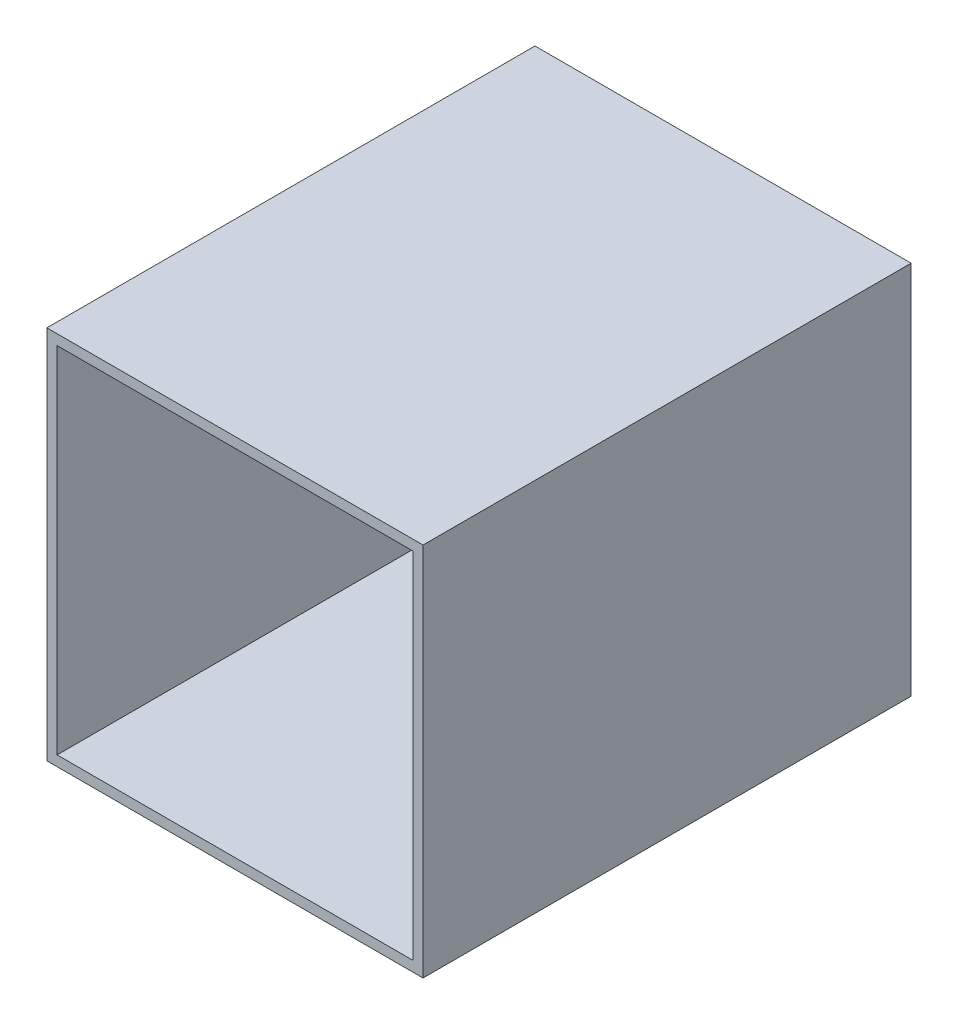
ISO-10303-21;
HEADER;
FILE_DESCRIPTION(('STEP AP214'),'2;1');
FILE_NAME('part.step','',(''),(''),'','','');
FILE_SCHEMA(('AUTOMOTIVE_DESIGN { 1 0 10303 214 1 1 1 1 }'));
ENDSEC;
DATA;
#1=APPLICATION_CONTEXT('core data for automotive mechanical design processes');
#2=APPLICATION_PROTOCOL_DEFINITION('international standard','automotive_design',2000,#1);
#3=PRODUCT_CONTEXT('',#1,'mechanical');
#4=PRODUCT('Part','Part','',(#3));
#5=PRODUCT_RELATED_PRODUCT_CATEGORY('part','',(#4));
#6=PRODUCT_DEFINITION_FORMATION('','',#4);
#7=PRODUCT_DEFINITION_CONTEXT('part definition',#1,'design');
#8=PRODUCT_DEFINITION('design','',#6,#7);
#9=PRODUCT_DEFINITION_SHAPE('','',#8);
#10=(LENGTH_UNIT() NAMED_UNIT(*) SI_UNIT(.MILLI.,.METRE.));
#11=(NAMED_UNIT(*) PLANE_ANGLE_UNIT() SI_UNIT($,.RADIAN.));
#12=(NAMED_UNIT(*) SI_UNIT($,.STERADIAN.) SOLID_ANGLE_UNIT());
#13=UNCERTAINTY_MEASURE_WITH_UNIT(LENGTH_MEASURE(1.E-05),#10,'distance_accuracy_value','');
#14=(GEOMETRIC_REPRESENTATION_CONTEXT(3) GLOBAL_UNCERTAINTY_ASSIGNED_CONTEXT((#13)) GLOBAL_UNIT_ASSIGNED_CONTEXT((#10,
#11,#12)) REPRESENTATION_CONTEXT('',''));
#15=CARTESIAN_POINT('',(0.,0.,0.));
#16=DIRECTION('',(0.,0.,1.));
#17=DIRECTION('',(1.,0.,0.));
#18=AXIS2_PLACEMENT_3D('',#15,#16,#17);
#19=CARTESIAN_POINT('',(-74.5,74.25,204.5));
#20=DIRECTION('',(0.,-1.,0.));
#21=DIRECTION('',(0.,0.,-1.));
#22=AXIS2_PLACEMENT_3D('',#19,#20,#21);
#23=PLANE('',#22);
#24=DIRECTION('',(0.,0.,-1.));
#25=VECTOR('',#24,1.);
#26=CARTESIAN_POINT('',(-74.5,74.25,204.5));
#27=LINE('',#26,#25);
#28=CARTESIAN_POINT('',(-74.5,74.25,204.5));
#29=VERTEX_POINT('',#28);
#30=CARTESIAN_POINT('',(-74.5,74.25,4.));
#31=VERTEX_POINT('',#30);
#32=EDGE_CURVE('E118',#29,#31,#27,.T.);
#33=ORIENTED_EDGE('',*,*,#32,.T.);
#34=DIRECTION('',(1.,0.,0.));
#35=VECTOR('',#34,1.);
#36=CARTESIAN_POINT('',(-74.5,74.25,4.));
#37=LINE('',#36,#35);
#38=CARTESIAN_POINT('',(74.5,74.25,4.));
#39=VERTEX_POINT('',#38);
#40=EDGE_CURVE('E109',#31,#39,#37,.T.);
#41=ORIENTED_EDGE('',*,*,#40,.T.);
#42=DIRECTION('',(0.,0.,-1.));
#43=VECTOR('',#42,1.);
#44=CARTESIAN_POINT('',(74.5,74.25,204.5));
#45=LINE('',#44,#43);
#46=CARTESIAN_POINT('',(74.5,74.25,204.5));
#47=VERTEX_POINT('',#46);
#48=EDGE_CURVE('E115',#47,#39,#45,.T.);
#49=ORIENTED_EDGE('',*,*,#48,.F.);
#50=DIRECTION('',(-1.,0.,0.));
#51=VECTOR('',#50,1.);
#52=CARTESIAN_POINT('',(-74.5,74.25,204.5));
#53=LINE('',#52,#51);
#54=EDGE_CURVE('E120',#47,#29,#53,.T.);
#55=ORIENTED_EDGE('',*,*,#54,.T.);
#56=EDGE_LOOP('',(#33,#41,#49,#55));
#57=FACE_BOUND('',#56,.T.);
#58=ADVANCED_FACE('F45',(#57),#23,.T.);
#59=CARTESIAN_POINT('',(-74.5,74.25,204.5));
#60=DIRECTION('',(1.,0.,0.));
#61=DIRECTION('',(0.,0.,-1.));
#62=AXIS2_PLACEMENT_3D('',#59,#60,#61);
#63=PLANE('',#62);
#64=DIRECTION('',(0.,0.,-1.));
#65=VECTOR('',#64,1.);
#66=CARTESIAN_POINT('',(-74.5,-74.25,204.5));
#67=LINE('',#66,#65);
#68=CARTESIAN_POINT('',(-74.5,-74.25,204.5));
#69=VERTEX_POINT('',#68);
#70=CARTESIAN_POINT('',(-74.5,-74.25,3.99999999999998));
#71=VERTEX_POINT('',#70);
#72=EDGE_CURVE('E129',#69,#71,#67,.T.);
#73=ORIENTED_EDGE('',*,*,#72,.T.);
#74=DIRECTION('',(0.,-1.,0.));
#75=VECTOR('',#74,1.);
#76=CARTESIAN_POINT('',(-74.5,78.55,4.));
#77=LINE('',#76,#75);
#78=EDGE_CURVE('E216',#31,#71,#77,.T.);
#79=ORIENTED_EDGE('',*,*,#78,.F.);
#80=ORIENTED_EDGE('',*,*,#32,.F.);
#81=DIRECTION('',(0.,-1.,0.));
#82=VECTOR('',#81,1.);
#83=CARTESIAN_POINT('',(-74.5,74.25,204.5));
#84=LINE('',#83,#82);
#85=EDGE_CURVE('E205',#29,#69,#84,.T.);
#86=ORIENTED_EDGE('',*,*,#85,.T.);
#87=EDGE_LOOP('',(#73,#79,#80,#86));
#88=FACE_BOUND('',#87,.T.);
#89=ADVANCED_FACE('F243',(#88),#63,.T.);
#90=CARTESIAN_POINT('',(-74.5,-74.25,204.5));
#91=DIRECTION('',(0.,1.,0.));
#92=DIRECTION('',(0.,0.,1.));
#93=AXIS2_PLACEMENT_3D('',#90,#91,#92);
#94=PLANE('',#93);
#95=CARTESIAN_POINT('',(0.,-74.25,34.));
#96=DIRECTION('',(0.,1.,0.));
#97=DIRECTION('',(0.,0.,1.));
#98=AXIS2_PLACEMENT_3D('',#95,#96,#97);
#99=CIRCLE('',#98,11.);
#100=CARTESIAN_POINT('',(0.,-74.25,45.));
#101=VERTEX_POINT('',#100);
#102=EDGE_CURVE('E219',#101,#101,#99,.F.);
#103=ORIENTED_EDGE('',*,*,#102,.T.);
#104=EDGE_LOOP('',(#103));
#105=FACE_BOUND('',#104,.T.);
#106=DIRECTION('',(0.,0.,-1.));
#107=VECTOR('',#106,1.);
#108=CARTESIAN_POINT('',(74.5,-74.25,204.5));
#109=LINE('',#108,#107);
#110=CARTESIAN_POINT('',(74.5,-74.25,204.5));
#111=VERTEX_POINT('',#110);
#112=CARTESIAN_POINT('',(74.5,-74.25,4.));
#113=VERTEX_POINT('',#112);
#114=EDGE_CURVE('E67',#111,#113,#109,.T.);
#115=ORIENTED_EDGE('',*,*,#114,.T.);
#116=DIRECTION('',(-1.,0.,0.));
#117=VECTOR('',#116,1.);
#118=CARTESIAN_POINT('',(-74.5,-74.25,3.99999999999998));
#119=LINE('',#118,#117);
#120=EDGE_CURVE('E61',#113,#71,#119,.T.);
#121=ORIENTED_EDGE('',*,*,#120,.T.);
#122=ORIENTED_EDGE('',*,*,#72,.F.);
#123=DIRECTION('',(1.,0.,0.));
#124=VECTOR('',#123,1.);
#125=CARTESIAN_POINT('',(-74.5,-74.25,204.5));
#126=LINE('',#125,#124);
#127=EDGE_CURVE('E131',#69,#111,#126,.T.);
#128=ORIENTED_EDGE('',*,*,#127,.T.);
#129=EDGE_LOOP('',(#115,#121,#122,#128));
#130=FACE_BOUND('',#129,.T.);
#131=ADVANCED_FACE('F248',(#105,#130),#94,.T.);
#132=CARTESIAN_POINT('',(74.5,74.25,204.5));
#133=DIRECTION('',(-1.,0.,0.));
#134=DIRECTION('',(0.,0.,1.));
#135=AXIS2_PLACEMENT_3D('',#132,#133,#134);
#136=PLANE('',#135);
#137=ORIENTED_EDGE('',*,*,#48,.T.);
#138=DIRECTION('',(0.,-1.,0.));
#139=VECTOR('',#138,1.);
#140=CARTESIAN_POINT('',(74.5,74.25,4.));
#141=LINE('',#140,#139);
#142=EDGE_CURVE('E11',#39,#113,#141,.T.);
#143=ORIENTED_EDGE('',*,*,#142,.T.);
#144=ORIENTED_EDGE('',*,*,#114,.F.);
#145=DIRECTION('',(0.,1.,0.));
#146=VECTOR('',#145,1.);
#147=CARTESIAN_POINT('',(74.5,74.25,204.5));
#148=LINE('',#147,#146);
#149=EDGE_CURVE('E124',#111,#47,#148,.T.);
#150=ORIENTED_EDGE('',*,*,#149,.T.);
#151=EDGE_LOOP('',(#137,#143,#144,#150));
#152=FACE_BOUND('',#151,.T.);
#153=ADVANCED_FACE('F122',(#152),#136,.T.);
#154=CARTESIAN_POINT('',(0.,0.,204.5));
#155=DIRECTION('',(0.,0.,1.));
#156=DIRECTION('',(1.,0.,0.));
#157=AXIS2_PLACEMENT_3D('',#154,#155,#156);
#158=PLANE('',#157);
#159=DIRECTION('',(0.,1.,0.));
#160=VECTOR('',#159,1.);
#161=CARTESIAN_POINT('',(78.8,78.55,204.5));
#162=LINE('',#161,#160);
#163=CARTESIAN_POINT('',(78.8,-78.55,204.5));
#164=VERTEX_POINT('',#163);
#165=CARTESIAN_POINT('',(78.8,78.55,204.5));
#166=VERTEX_POINT('',#165);
#167=EDGE_CURVE('E141',#164,#166,#162,.T.);
#168=ORIENTED_EDGE('',*,*,#167,.T.);
#169=DIRECTION('',(-1.,0.,0.));
#170=VECTOR('',#169,1.);
#171=CARTESIAN_POINT('',(-78.8,78.55,204.5));
#172=LINE('',#171,#170);
#173=CARTESIAN_POINT('',(-78.8,78.55,204.5));
#174=VERTEX_POINT('',#173);
#175=EDGE_CURVE('E145',#166,#174,#172,.T.);
#176=ORIENTED_EDGE('',*,*,#175,.T.);
#177=DIRECTION('',(0.,-1.,0.));
#178=VECTOR('',#177,1.);
#179=CARTESIAN_POINT('',(-78.8,78.55,204.5));
#180=LINE('',#179,#178);
#181=CARTESIAN_POINT('',(-78.8,-78.55,204.5));
#182=VERTEX_POINT('',#181);
#183=EDGE_CURVE('E149',#174,#182,#180,.T.);
#184=ORIENTED_EDGE('',*,*,#183,.T.);
#185=DIRECTION('',(1.,0.,0.));
#186=VECTOR('',#185,1.);
#187=CARTESIAN_POINT('',(-78.8,-78.55,204.5));
#188=LINE('',#187,#186);
#189=EDGE_CURVE('E152',#182,#164,#188,.T.);
#190=ORIENTED_EDGE('',*,*,#189,.T.);
#191=EDGE_LOOP('',(#168,#176,#184,#190));
#192=FACE_BOUND('',#191,.T.);
#193=ORIENTED_EDGE('',*,*,#85,.F.);
#194=ORIENTED_EDGE('',*,*,#54,.F.);
#195=ORIENTED_EDGE('',*,*,#149,.F.);
#196=ORIENTED_EDGE('',*,*,#127,.F.);
#197=EDGE_LOOP('',(#193,#194,#195,#196));
#198=FACE_BOUND('',#197,.T.);
#199=ADVANCED_FACE('F199',(#192,#198),#158,.T.);
#200=CARTESIAN_POINT('',(0.,0.,0.));
#201=DIRECTION('',(0.,0.,1.));
#202=DIRECTION('',(1.,0.,0.));
#203=AXIS2_PLACEMENT_3D('',#200,#201,#202);
#204=PLANE('',#203);
#205=DIRECTION('',(0.,1.,0.));
#206=VECTOR('',#205,1.);
#207=CARTESIAN_POINT('',(78.8,78.55,0.));
#208=LINE('',#207,#206);
#209=CARTESIAN_POINT('',(78.8,-78.55,0.));
#210=VERTEX_POINT('',#209);
#211=CARTESIAN_POINT('',(78.8,78.55,0.));
#212=VERTEX_POINT('',#211);
#213=EDGE_CURVE('E140',#210,#212,#208,.T.);
#214=ORIENTED_EDGE('',*,*,#213,.F.);
#215=DIRECTION('',(1.,0.,0.));
#216=VECTOR('',#215,1.);
#217=CARTESIAN_POINT('',(-78.8,-78.55,0.));
#218=LINE('',#217,#216);
#219=CARTESIAN_POINT('',(-78.8,-78.55,0.));
#220=VERTEX_POINT('',#219);
#221=EDGE_CURVE('E146',#220,#210,#218,.T.);
#222=ORIENTED_EDGE('',*,*,#221,.F.);
#223=DIRECTION('',(0.,-1.,0.));
#224=VECTOR('',#223,1.);
#225=CARTESIAN_POINT('',(-78.8,78.55,0.));
#226=LINE('',#225,#224);
#227=CARTESIAN_POINT('',(-78.8,78.55,0.));
#228=VERTEX_POINT('',#227);
#229=EDGE_CURVE('E162',#228,#220,#226,.T.);
#230=ORIENTED_EDGE('',*,*,#229,.F.);
#231=DIRECTION('',(-1.,0.,0.));
#232=VECTOR('',#231,1.);
#233=CARTESIAN_POINT('',(-78.8,78.55,0.));
#234=LINE('',#233,#232);
#235=EDGE_CURVE('E159',#212,#228,#234,.T.);
#236=ORIENTED_EDGE('',*,*,#235,.F.);
#237=EDGE_LOOP('',(#214,#222,#230,#236));
#238=FACE_BOUND('',#237,.T.);
#239=ADVANCED_FACE('F189',(#238),#204,.F.);
#240=CARTESIAN_POINT('',(78.8,78.55,204.5));
#241=DIRECTION('',(-1.,0.,0.));
#242=DIRECTION('',(0.,-1.,0.));
#243=AXIS2_PLACEMENT_3D('',#240,#241,#242);
#244=PLANE('',#243);
#245=ORIENTED_EDGE('',*,*,#213,.T.);
#246=DIRECTION('',(0.,0.,-1.));
#247=VECTOR('',#246,1.);
#248=CARTESIAN_POINT('',(78.8,78.55,204.5));
#249=LINE('',#248,#247);
#250=EDGE_CURVE('E54',#166,#212,#249,.T.);
#251=ORIENTED_EDGE('',*,*,#250,.F.);
#252=ORIENTED_EDGE('',*,*,#167,.F.);
#253=DIRECTION('',(0.,0.,-1.));
#254=VECTOR('',#253,1.);
#255=CARTESIAN_POINT('',(78.8,-78.55,204.5));
#256=LINE('',#255,#254);
#257=EDGE_CURVE('E155',#164,#210,#256,.T.);
#258=ORIENTED_EDGE('',*,*,#257,.T.);
#259=EDGE_LOOP('',(#245,#251,#252,#258));
#260=FACE_BOUND('',#259,.T.);
#261=ADVANCED_FACE('F47',(#260),#244,.F.);
#262=CARTESIAN_POINT('',(-78.8,78.55,204.5));
#263=DIRECTION('',(0.,-1.,0.));
#264=DIRECTION('',(0.,0.,-1.));
#265=AXIS2_PLACEMENT_3D('',#262,#263,#264);
#266=PLANE('',#265);
#267=ORIENTED_EDGE('',*,*,#235,.T.);
#268=DIRECTION('',(0.,0.,-1.));
#269=VECTOR('',#268,1.);
#270=CARTESIAN_POINT('',(-78.8,78.55,204.5));
#271=LINE('',#270,#269);
#272=EDGE_CURVE('E174',#174,#228,#271,.T.);
#273=ORIENTED_EDGE('',*,*,#272,.F.);
#274=ORIENTED_EDGE('',*,*,#175,.F.);
#275=ORIENTED_EDGE('',*,*,#250,.T.);
#276=EDGE_LOOP('',(#267,#273,#274,#275));
#277=FACE_BOUND('',#276,.T.);
#278=ADVANCED_FACE('F181',(#277),#266,.F.);
#279=CARTESIAN_POINT('',(-78.8,78.55,204.5));
#280=DIRECTION('',(1.,0.,0.));
#281=DIRECTION('',(0.,1.,0.));
#282=AXIS2_PLACEMENT_3D('',#279,#280,#281);
#283=PLANE('',#282);
#284=ORIENTED_EDGE('',*,*,#229,.T.);
#285=DIRECTION('',(0.,0.,-1.));
#286=VECTOR('',#285,1.);
#287=CARTESIAN_POINT('',(-78.8,-78.55,204.5));
#288=LINE('',#287,#286);
#289=EDGE_CURVE('E170',#182,#220,#288,.T.);
#290=ORIENTED_EDGE('',*,*,#289,.F.);
#291=ORIENTED_EDGE('',*,*,#183,.F.);
#292=ORIENTED_EDGE('',*,*,#272,.T.);
#293=EDGE_LOOP('',(#284,#290,#291,#292));
#294=FACE_BOUND('',#293,.T.);
#295=ADVANCED_FACE('F193',(#294),#283,.F.);
#296=CARTESIAN_POINT('',(-78.8,-78.55,204.5));
#297=DIRECTION('',(0.,1.,0.));
#298=DIRECTION('',(0.,0.,1.));
#299=AXIS2_PLACEMENT_3D('',#296,#297,#298);
#300=PLANE('',#299);
#301=CARTESIAN_POINT('',(0.,-78.55,34.));
#302=DIRECTION('',(0.,-1.,0.));
#303=DIRECTION('',(0.,0.,-1.));
#304=AXIS2_PLACEMENT_3D('',#301,#302,#303);
#305=CIRCLE('',#304,11.);
#306=CARTESIAN_POINT('',(0.,-78.55,23.));
#307=VERTEX_POINT('',#306);
#308=EDGE_CURVE('E223',#307,#307,#305,.T.);
#309=ORIENTED_EDGE('',*,*,#308,.F.);
#310=EDGE_LOOP('',(#309));
#311=FACE_BOUND('',#310,.T.);
#312=ORIENTED_EDGE('',*,*,#221,.T.);
#313=ORIENTED_EDGE('',*,*,#257,.F.);
#314=ORIENTED_EDGE('',*,*,#189,.F.);
#315=ORIENTED_EDGE('',*,*,#289,.T.);
#316=EDGE_LOOP('',(#312,#313,#314,#315));
#317=FACE_BOUND('',#316,.T.);
#318=ADVANCED_FACE('F197',(#311,#317),#300,.F.);
#319=CARTESIAN_POINT('',(231.650914728486,78.55,4.));
#320=DIRECTION('',(0.,0.,-1.));
#321=DIRECTION('',(0.,1.,0.));
#322=AXIS2_PLACEMENT_3D('',#319,#320,#321);
#323=PLANE('',#322);
#324=ORIENTED_EDGE('',*,*,#40,.F.);
#325=ORIENTED_EDGE('',*,*,#78,.T.);
#326=ORIENTED_EDGE('',*,*,#120,.F.);
#327=ORIENTED_EDGE('',*,*,#142,.F.);
#328=EDGE_LOOP('',(#324,#325,#326,#327));
#329=FACE_BOUND('',#328,.T.);
#330=ADVANCED_FACE('F108',(#329),#323,.F.);
#331=CARTESIAN_POINT('',(0.,-43.1373016277919,34.));
#332=DIRECTION('',(0.,-1.,0.));
#333=DIRECTION('',(0.,0.,-1.));
#334=AXIS2_PLACEMENT_3D('',#331,#332,#333);
#335=CYLINDRICAL_SURFACE('',#334,11.);
#336=ORIENTED_EDGE('',*,*,#308,.T.);
#337=EDGE_LOOP('',(#336));
#338=FACE_BOUND('',#337,.T.);
#339=ORIENTED_EDGE('',*,*,#102,.F.);
#340=EDGE_LOOP('',(#339));
#341=FACE_BOUND('',#340,.T.);
#342=ADVANCED_FACE('F228',(#338,#341),#335,.F.);
#343=CLOSED_SHELL('',(#58,#89,#131,#153,#199,#239,#261,#278,#295,#318,#330,#342));
#344=MANIFOLD_SOLID_BREP('B2',#343);
#345=ADVANCED_BREP_SHAPE_REPRESENTATION('',(#18,#344),#14);
#346=SHAPE_DEFINITION_REPRESENTATION(#9,#345);
ENDSEC;
END-ISO-10303-21;
